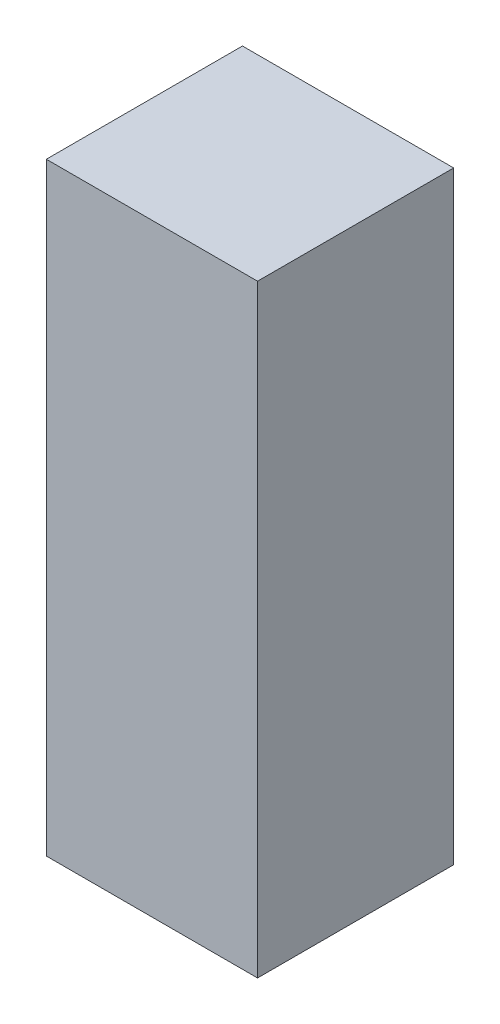
ISO-10303-21;
HEADER;
FILE_DESCRIPTION(('STEP AP214'),'2;1');
FILE_NAME('part.step','',(''),(''),'','','');
FILE_SCHEMA(('AUTOMOTIVE_DESIGN { 1 0 10303 214 1 1 1 1 }'));
ENDSEC;
DATA;
#1=APPLICATION_CONTEXT('core data for automotive mechanical design processes');
#2=APPLICATION_PROTOCOL_DEFINITION('international standard','automotive_design',2000,#1);
#3=PRODUCT_CONTEXT('',#1,'mechanical');
#4=PRODUCT('Part','Part','',(#3));
#5=PRODUCT_RELATED_PRODUCT_CATEGORY('part','',(#4));
#6=PRODUCT_DEFINITION_FORMATION('','',#4);
#7=PRODUCT_DEFINITION_CONTEXT('part definition',#1,'design');
#8=PRODUCT_DEFINITION('design','',#6,#7);
#9=PRODUCT_DEFINITION_SHAPE('','',#8);
#10=(LENGTH_UNIT() NAMED_UNIT(*) SI_UNIT(.MILLI.,.METRE.));
#11=(NAMED_UNIT(*) PLANE_ANGLE_UNIT() SI_UNIT($,.RADIAN.));
#12=(NAMED_UNIT(*) SI_UNIT($,.STERADIAN.) SOLID_ANGLE_UNIT());
#13=UNCERTAINTY_MEASURE_WITH_UNIT(LENGTH_MEASURE(1.E-05),#10,'distance_accuracy_value','');
#14=(GEOMETRIC_REPRESENTATION_CONTEXT(3) GLOBAL_UNCERTAINTY_ASSIGNED_CONTEXT((#13)) GLOBAL_UNIT_ASSIGNED_CONTEXT((#10,
#11,#12)) REPRESENTATION_CONTEXT('',''));
#15=CARTESIAN_POINT('',(0.,0.,0.));
#16=DIRECTION('',(0.,0.,1.));
#17=DIRECTION('',(1.,0.,0.));
#18=AXIS2_PLACEMENT_3D('',#15,#16,#17);
#19=CARTESIAN_POINT('',(24.,160.,33.));
#20=DIRECTION('',(1.,0.,0.));
#21=DIRECTION('',(0.,0.,-1.));
#22=AXIS2_PLACEMENT_3D('',#19,#20,#21);
#23=PLANE('',#22);
#24=DIRECTION('',(0.,-1.,0.));
#25=VECTOR('',#24,1.);
#26=CARTESIAN_POINT('',(24.,160.,20.));
#27=LINE('',#26,#25);
#28=CARTESIAN_POINT('',(24.,200.,20.));
#29=VERTEX_POINT('',#28);
#30=CARTESIAN_POINT('',(24.,160.,20.));
#31=VERTEX_POINT('',#30);
#32=EDGE_CURVE('E102',#29,#31,#27,.T.);
#33=ORIENTED_EDGE('',*,*,#32,.T.);
#34=DIRECTION('',(0.,0.,-1.));
#35=VECTOR('',#34,1.);
#36=CARTESIAN_POINT('',(24.,160.,33.));
#37=LINE('',#36,#35);
#38=CARTESIAN_POINT('',(24.,160.,33.));
#39=VERTEX_POINT('',#38);
#40=EDGE_CURVE('E11',#39,#31,#37,.T.);
#41=ORIENTED_EDGE('',*,*,#40,.F.);
#42=DIRECTION('',(0.,-1.,0.));
#43=VECTOR('',#42,1.);
#44=CARTESIAN_POINT('',(24.,160.,33.));
#45=LINE('',#44,#43);
#46=CARTESIAN_POINT('',(24.,200.,33.));
#47=VERTEX_POINT('',#46);
#48=EDGE_CURVE('E90',#47,#39,#45,.T.);
#49=ORIENTED_EDGE('',*,*,#48,.F.);
#50=DIRECTION('',(0.,0.,-1.));
#51=VECTOR('',#50,1.);
#52=CARTESIAN_POINT('',(24.,200.,33.));
#53=LINE('',#52,#51);
#54=EDGE_CURVE('E98',#47,#29,#53,.T.);
#55=ORIENTED_EDGE('',*,*,#54,.T.);
#56=EDGE_LOOP('',(#33,#41,#49,#55));
#57=FACE_BOUND('',#56,.T.);
#58=ADVANCED_FACE('F39',(#57),#23,.F.);
#59=CARTESIAN_POINT('',(24.,160.,33.));
#60=DIRECTION('',(0.,1.,0.));
#61=DIRECTION('',(0.,0.,1.));
#62=AXIS2_PLACEMENT_3D('',#59,#60,#61);
#63=PLANE('',#62);
#64=DIRECTION('',(1.,0.,0.));
#65=VECTOR('',#64,1.);
#66=CARTESIAN_POINT('',(24.,160.,20.));
#67=LINE('',#66,#65);
#68=CARTESIAN_POINT('',(38.,160.,20.));
#69=VERTEX_POINT('',#68);
#70=EDGE_CURVE('E94',#31,#69,#67,.T.);
#71=ORIENTED_EDGE('',*,*,#70,.T.);
#72=DIRECTION('',(0.,0.,-1.));
#73=VECTOR('',#72,1.);
#74=CARTESIAN_POINT('',(38.,160.,33.));
#75=LINE('',#74,#73);
#76=CARTESIAN_POINT('',(38.,160.,33.));
#77=VERTEX_POINT('',#76);
#78=EDGE_CURVE('E47',#77,#69,#75,.T.);
#79=ORIENTED_EDGE('',*,*,#78,.F.);
#80=DIRECTION('',(1.,0.,0.));
#81=VECTOR('',#80,1.);
#82=CARTESIAN_POINT('',(24.,160.,33.));
#83=LINE('',#82,#81);
#84=EDGE_CURVE('E85',#39,#77,#83,.T.);
#85=ORIENTED_EDGE('',*,*,#84,.F.);
#86=ORIENTED_EDGE('',*,*,#40,.T.);
#87=EDGE_LOOP('',(#71,#79,#85,#86));
#88=FACE_BOUND('',#87,.T.);
#89=ADVANCED_FACE('F93',(#88),#63,.F.);
#90=CARTESIAN_POINT('',(38.,160.,33.));
#91=DIRECTION('',(-1.,0.,0.));
#92=DIRECTION('',(0.,0.,1.));
#93=AXIS2_PLACEMENT_3D('',#90,#91,#92);
#94=PLANE('',#93);
#95=DIRECTION('',(0.,1.,0.));
#96=VECTOR('',#95,1.);
#97=CARTESIAN_POINT('',(38.,160.,20.));
#98=LINE('',#97,#96);
#99=CARTESIAN_POINT('',(38.,200.,20.));
#100=VERTEX_POINT('',#99);
#101=EDGE_CURVE('E72',#69,#100,#98,.T.);
#102=ORIENTED_EDGE('',*,*,#101,.T.);
#103=DIRECTION('',(0.,0.,-1.));
#104=VECTOR('',#103,1.);
#105=CARTESIAN_POINT('',(38.,200.,33.));
#106=LINE('',#105,#104);
#107=CARTESIAN_POINT('',(38.,200.,33.));
#108=VERTEX_POINT('',#107);
#109=EDGE_CURVE('E95',#108,#100,#106,.T.);
#110=ORIENTED_EDGE('',*,*,#109,.F.);
#111=DIRECTION('',(0.,1.,0.));
#112=VECTOR('',#111,1.);
#113=CARTESIAN_POINT('',(38.,160.,33.));
#114=LINE('',#113,#112);
#115=EDGE_CURVE('E88',#77,#108,#114,.T.);
#116=ORIENTED_EDGE('',*,*,#115,.F.);
#117=ORIENTED_EDGE('',*,*,#78,.T.);
#118=EDGE_LOOP('',(#102,#110,#116,#117));
#119=FACE_BOUND('',#118,.T.);
#120=ADVANCED_FACE('F96',(#119),#94,.F.);
#121=CARTESIAN_POINT('',(24.,200.,33.));
#122=DIRECTION('',(0.,-1.,0.));
#123=DIRECTION('',(0.,0.,-1.));
#124=AXIS2_PLACEMENT_3D('',#121,#122,#123);
#125=PLANE('',#124);
#126=DIRECTION('',(-1.,0.,0.));
#127=VECTOR('',#126,1.);
#128=CARTESIAN_POINT('',(24.,200.,20.));
#129=LINE('',#128,#127);
#130=EDGE_CURVE('E78',#100,#29,#129,.T.);
#131=ORIENTED_EDGE('',*,*,#130,.T.);
#132=ORIENTED_EDGE('',*,*,#54,.F.);
#133=DIRECTION('',(-1.,0.,0.));
#134=VECTOR('',#133,1.);
#135=CARTESIAN_POINT('',(24.,200.,33.));
#136=LINE('',#135,#134);
#137=EDGE_CURVE('E55',#108,#47,#136,.T.);
#138=ORIENTED_EDGE('',*,*,#137,.F.);
#139=ORIENTED_EDGE('',*,*,#109,.T.);
#140=EDGE_LOOP('',(#131,#132,#138,#139));
#141=FACE_BOUND('',#140,.T.);
#142=ADVANCED_FACE('F109',(#141),#125,.F.);
#143=CARTESIAN_POINT('',(0.,0.,33.));
#144=DIRECTION('',(0.,0.,-1.));
#145=DIRECTION('',(-1.,0.,0.));
#146=AXIS2_PLACEMENT_3D('',#143,#144,#145);
#147=PLANE('',#146);
#148=ORIENTED_EDGE('',*,*,#48,.T.);
#149=ORIENTED_EDGE('',*,*,#84,.T.);
#150=ORIENTED_EDGE('',*,*,#115,.T.);
#151=ORIENTED_EDGE('',*,*,#137,.T.);
#152=EDGE_LOOP('',(#148,#149,#150,#151));
#153=FACE_BOUND('',#152,.T.);
#154=ADVANCED_FACE('F86',(#153),#147,.F.);
#155=CARTESIAN_POINT('',(0.,0.,20.));
#156=DIRECTION('',(0.,0.,-1.));
#157=DIRECTION('',(-1.,0.,0.));
#158=AXIS2_PLACEMENT_3D('',#155,#156,#157);
#159=PLANE('',#158);
#160=ORIENTED_EDGE('',*,*,#32,.F.);
#161=ORIENTED_EDGE('',*,*,#130,.F.);
#162=ORIENTED_EDGE('',*,*,#101,.F.);
#163=ORIENTED_EDGE('',*,*,#70,.F.);
#164=EDGE_LOOP('',(#160,#161,#162,#163));
#165=FACE_BOUND('',#164,.T.);
#166=ADVANCED_FACE('F112',(#165),#159,.T.);
#167=CLOSED_SHELL('',(#58,#89,#120,#142,#154,#166));
#168=MANIFOLD_SOLID_BREP('B2',#167);
#169=ADVANCED_BREP_SHAPE_REPRESENTATION('',(#18,#168),#14);
#170=SHAPE_DEFINITION_REPRESENTATION(#9,#169);
ENDSEC;
END-ISO-10303-21;
